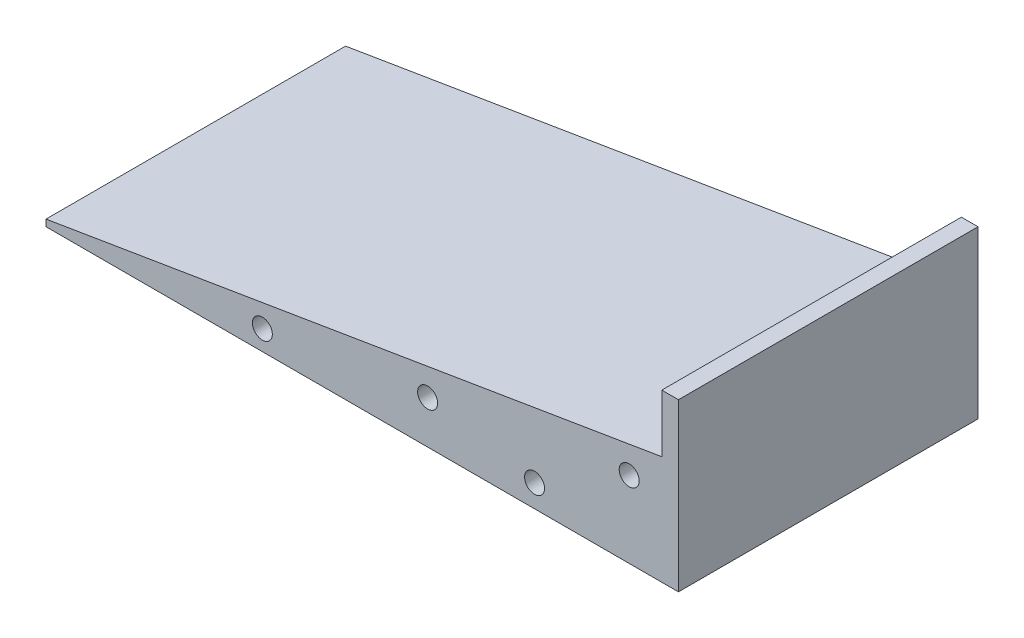
ISO-10303-21;
HEADER;
FILE_DESCRIPTION(('STEP AP214'),'2;1');
FILE_NAME('part.step','',(''),(''),'','','');
FILE_SCHEMA(('AUTOMOTIVE_DESIGN { 1 0 10303 214 1 1 1 1 }'));
ENDSEC;
DATA;
#1=APPLICATION_CONTEXT('core data for automotive mechanical design processes');
#2=APPLICATION_PROTOCOL_DEFINITION('international standard','automotive_design',2000,#1);
#3=PRODUCT_CONTEXT('',#1,'mechanical');
#4=PRODUCT('Part','Part','',(#3));
#5=PRODUCT_RELATED_PRODUCT_CATEGORY('part','',(#4));
#6=PRODUCT_DEFINITION_FORMATION('','',#4);
#7=PRODUCT_DEFINITION_CONTEXT('part definition',#1,'design');
#8=PRODUCT_DEFINITION('design','',#6,#7);
#9=PRODUCT_DEFINITION_SHAPE('','',#8);
#10=(LENGTH_UNIT() NAMED_UNIT(*) SI_UNIT(.MILLI.,.METRE.));
#11=(NAMED_UNIT(*) PLANE_ANGLE_UNIT() SI_UNIT($,.RADIAN.));
#12=(NAMED_UNIT(*) SI_UNIT($,.STERADIAN.) SOLID_ANGLE_UNIT());
#13=UNCERTAINTY_MEASURE_WITH_UNIT(LENGTH_MEASURE(1.E-05),#10,'distance_accuracy_value','');
#14=(GEOMETRIC_REPRESENTATION_CONTEXT(3) GLOBAL_UNCERTAINTY_ASSIGNED_CONTEXT((#13)) GLOBAL_UNIT_ASSIGNED_CONTEXT((#10,
#11,#12)) REPRESENTATION_CONTEXT('',''));
#15=CARTESIAN_POINT('',(0.,0.,0.));
#16=DIRECTION('',(0.,0.,1.));
#17=DIRECTION('',(1.,0.,0.));
#18=AXIS2_PLACEMENT_3D('',#15,#16,#17);
#19=CARTESIAN_POINT('',(-40.7960134047091,6.,200.));
#20=DIRECTION('',(0.,0.,-1.));
#21=DIRECTION('',(-1.,0.,0.));
#22=AXIS2_PLACEMENT_3D('',#19,#20,#21);
#23=CYLINDRICAL_SURFACE('',#22,3.);
#24=CARTESIAN_POINT('',(-40.7960134047091,6.,55.));
#25=DIRECTION('',(0.,0.,1.));
#26=DIRECTION('',(1.,0.,0.));
#27=AXIS2_PLACEMENT_3D('',#24,#25,#26);
#28=CIRCLE('',#27,3.);
#29=CARTESIAN_POINT('',(-37.7960134047091,6.,55.));
#30=VERTEX_POINT('',#29);
#31=EDGE_CURVE('E153',#30,#30,#28,.T.);
#32=ORIENTED_EDGE('',*,*,#31,.F.);
#33=EDGE_LOOP('',(#32));
#34=FACE_BOUND('',#33,.T.);
#35=CARTESIAN_POINT('',(-40.7960134047091,6.,145.));
#36=DIRECTION('',(0.,0.,-1.));
#37=DIRECTION('',(-1.,0.,0.));
#38=AXIS2_PLACEMENT_3D('',#35,#36,#37);
#39=CIRCLE('',#38,3.);
#40=CARTESIAN_POINT('',(-43.7960134047091,6.,145.));
#41=VERTEX_POINT('',#40);
#42=EDGE_CURVE('E133',#41,#41,#39,.T.);
#43=ORIENTED_EDGE('',*,*,#42,.F.);
#44=EDGE_LOOP('',(#43));
#45=FACE_BOUND('',#44,.T.);
#46=ADVANCED_FACE('F35',(#34,#45),#23,.F.);
#47=CARTESIAN_POINT('',(8.86154286614935,12.9010851063287,200.));
#48=DIRECTION('',(0.,0.,-1.));
#49=DIRECTION('',(-1.,0.,0.));
#50=AXIS2_PLACEMENT_3D('',#47,#48,#49);
#51=CYLINDRICAL_SURFACE('',#50,3.);
#52=CARTESIAN_POINT('',(8.86154286614935,12.9010851063287,55.));
#53=DIRECTION('',(0.,0.,1.));
#54=DIRECTION('',(1.,0.,0.));
#55=AXIS2_PLACEMENT_3D('',#52,#53,#54);
#56=CIRCLE('',#55,3.);
#57=CARTESIAN_POINT('',(11.8615428661494,12.9010851063287,55.));
#58=VERTEX_POINT('',#57);
#59=EDGE_CURVE('E156',#58,#58,#56,.T.);
#60=ORIENTED_EDGE('',*,*,#59,.F.);
#61=EDGE_LOOP('',(#60));
#62=FACE_BOUND('',#61,.T.);
#63=CARTESIAN_POINT('',(8.86154286614935,12.9010851063287,145.));
#64=DIRECTION('',(0.,0.,-1.));
#65=DIRECTION('',(-1.,0.,0.));
#66=AXIS2_PLACEMENT_3D('',#63,#64,#65);
#67=CIRCLE('',#66,3.);
#68=CARTESIAN_POINT('',(5.86154286614935,12.9010851063287,145.));
#69=VERTEX_POINT('',#68);
#70=EDGE_CURVE('E135',#69,#69,#67,.T.);
#71=ORIENTED_EDGE('',*,*,#70,.F.);
#72=EDGE_LOOP('',(#71));
#73=FACE_BOUND('',#72,.T.);
#74=ADVANCED_FACE('F180',(#62,#73),#51,.F.);
#75=CARTESIAN_POINT('',(40.9814690667464,6.77616521020496,200.));
#76=DIRECTION('',(0.,0.,-1.));
#77=DIRECTION('',(-1.,0.,0.));
#78=AXIS2_PLACEMENT_3D('',#75,#76,#77);
#79=CYLINDRICAL_SURFACE('',#78,3.00000000000001);
#80=CARTESIAN_POINT('',(40.9814690667464,6.77616521020496,55.));
#81=DIRECTION('',(0.,0.,1.));
#82=DIRECTION('',(1.,0.,0.));
#83=AXIS2_PLACEMENT_3D('',#80,#81,#82);
#84=CIRCLE('',#83,3.00000000000001);
#85=CARTESIAN_POINT('',(43.9814690667464,6.77616521020496,55.));
#86=VERTEX_POINT('',#85);
#87=EDGE_CURVE('E159',#86,#86,#84,.T.);
#88=ORIENTED_EDGE('',*,*,#87,.F.);
#89=EDGE_LOOP('',(#88));
#90=FACE_BOUND('',#89,.T.);
#91=CARTESIAN_POINT('',(40.9814690667464,6.77616521020496,145.));
#92=DIRECTION('',(0.,0.,-1.));
#93=DIRECTION('',(-1.,0.,0.));
#94=AXIS2_PLACEMENT_3D('',#91,#92,#93);
#95=CIRCLE('',#94,3.00000000000001);
#96=CARTESIAN_POINT('',(37.9814690667464,6.77616521020496,145.));
#97=VERTEX_POINT('',#96);
#98=EDGE_CURVE('E140',#97,#97,#95,.T.);
#99=ORIENTED_EDGE('',*,*,#98,.F.);
#100=EDGE_LOOP('',(#99));
#101=FACE_BOUND('',#100,.T.);
#102=ADVANCED_FACE('F186',(#90,#101),#79,.F.);
#103=CARTESIAN_POINT('',(69.4060048708337,22.9393971638675,200.));
#104=DIRECTION('',(0.,0.,-1.));
#105=DIRECTION('',(-1.,0.,0.));
#106=AXIS2_PLACEMENT_3D('',#103,#104,#105);
#107=CYLINDRICAL_SURFACE('',#106,3.00000000000001);
#108=CARTESIAN_POINT('',(69.4060048708337,22.9393971638675,55.));
#109=DIRECTION('',(0.,0.,1.));
#110=DIRECTION('',(1.,0.,0.));
#111=AXIS2_PLACEMENT_3D('',#108,#109,#110);
#112=CIRCLE('',#111,3.00000000000001);
#113=CARTESIAN_POINT('',(72.4060048708337,22.9393971638675,55.));
#114=VERTEX_POINT('',#113);
#115=EDGE_CURVE('E162',#114,#114,#112,.T.);
#116=ORIENTED_EDGE('',*,*,#115,.F.);
#117=EDGE_LOOP('',(#116));
#118=FACE_BOUND('',#117,.T.);
#119=CARTESIAN_POINT('',(69.4060048708337,22.9393971638675,145.));
#120=DIRECTION('',(0.,0.,-1.));
#121=DIRECTION('',(-1.,0.,0.));
#122=AXIS2_PLACEMENT_3D('',#119,#120,#121);
#123=CIRCLE('',#122,3.00000000000001);
#124=CARTESIAN_POINT('',(66.4060048708336,22.9393971638675,145.));
#125=VERTEX_POINT('',#124);
#126=EDGE_CURVE('E129',#125,#125,#123,.T.);
#127=ORIENTED_EDGE('',*,*,#126,.F.);
#128=EDGE_LOOP('',(#127));
#129=FACE_BOUND('',#128,.T.);
#130=ADVANCED_FACE('F195',(#118,#129),#107,.F.);
#131=CARTESIAN_POINT('',(-105.796013404709,2.,200.));
#132=DIRECTION('',(0.163567680624933,-0.986532114963816,0.));
#133=DIRECTION('',(0.986532114963816,0.163567680624933,0.));
#134=AXIS2_PLACEMENT_3D('',#131,#132,#133);
#135=PLANE('',#134);
#136=DIRECTION('',(0.,0.,-1.));
#137=VECTOR('',#136,1.);
#138=CARTESIAN_POINT('',(79.2039865952909,32.6731230100121,217.967909160371));
#139=LINE('',#138,#137);
#140=CARTESIAN_POINT('',(79.2039865952909,32.6731230100121,145.));
#141=VERTEX_POINT('',#140);
#142=CARTESIAN_POINT('',(79.2039865952909,32.6731230100121,55.));
#143=VERTEX_POINT('',#142);
#144=EDGE_CURVE('E112',#141,#143,#139,.T.);
#145=ORIENTED_EDGE('',*,*,#144,.T.);
#146=DIRECTION('',(-0.986532114963816,-0.163567680624933,0.));
#147=VECTOR('',#146,1.);
#148=CARTESIAN_POINT('',(-105.796013404709,1.99999999999999,55.));
#149=LINE('',#148,#147);
#150=CARTESIAN_POINT('',(-105.796013404709,2.,55.));
#151=VERTEX_POINT('',#150);
#152=EDGE_CURVE('E49',#143,#151,#149,.T.);
#153=ORIENTED_EDGE('',*,*,#152,.T.);
#154=DIRECTION('',(0.,0.,-1.));
#155=VECTOR('',#154,1.);
#156=CARTESIAN_POINT('',(-105.796013404709,2.,200.));
#157=LINE('',#156,#155);
#158=CARTESIAN_POINT('',(-105.796013404709,2.,145.));
#159=VERTEX_POINT('',#158);
#160=EDGE_CURVE('E107',#159,#151,#157,.T.);
#161=ORIENTED_EDGE('',*,*,#160,.F.);
#162=DIRECTION('',(0.986532114963816,0.163567680624933,0.));
#163=VECTOR('',#162,1.);
#164=CARTESIAN_POINT('',(-105.796013404709,2.,145.));
#165=LINE('',#164,#163);
#166=EDGE_CURVE('E121',#159,#141,#165,.T.);
#167=ORIENTED_EDGE('',*,*,#166,.T.);
#168=EDGE_LOOP('',(#145,#153,#161,#167));
#169=FACE_BOUND('',#168,.T.);
#170=ADVANCED_FACE('F128',(#169),#135,.F.);
#171=CARTESIAN_POINT('',(-105.796013404709,0.,200.));
#172=DIRECTION('',(1.,0.,0.));
#173=DIRECTION('',(0.,0.,-1.));
#174=AXIS2_PLACEMENT_3D('',#171,#172,#173);
#175=PLANE('',#174);
#176=ORIENTED_EDGE('',*,*,#160,.T.);
#177=DIRECTION('',(0.,1.,0.));
#178=VECTOR('',#177,1.);
#179=CARTESIAN_POINT('',(-105.796013404709,-199.248588451713,55.));
#180=LINE('',#179,#178);
#181=CARTESIAN_POINT('',(-105.796013404709,0.,55.));
#182=VERTEX_POINT('',#181);
#183=EDGE_CURVE('E95',#182,#151,#180,.T.);
#184=ORIENTED_EDGE('',*,*,#183,.F.);
#185=DIRECTION('',(0.,0.,-1.));
#186=VECTOR('',#185,1.);
#187=CARTESIAN_POINT('',(-105.796013404709,0.,200.));
#188=LINE('',#187,#186);
#189=CARTESIAN_POINT('',(-105.796013404709,0.,145.));
#190=VERTEX_POINT('',#189);
#191=EDGE_CURVE('E117',#190,#182,#188,.T.);
#192=ORIENTED_EDGE('',*,*,#191,.F.);
#193=DIRECTION('',(0.,1.,0.));
#194=VECTOR('',#193,1.);
#195=CARTESIAN_POINT('',(-105.796013404709,-199.248588451713,145.));
#196=LINE('',#195,#194);
#197=EDGE_CURVE('E148',#190,#159,#196,.T.);
#198=ORIENTED_EDGE('',*,*,#197,.T.);
#199=EDGE_LOOP('',(#176,#184,#192,#198));
#200=FACE_BOUND('',#199,.T.);
#201=ADVANCED_FACE('F37',(#200),#175,.F.);
#202=CARTESIAN_POINT('',(-105.796013404709,0.,200.));
#203=DIRECTION('',(0.,1.,0.));
#204=DIRECTION('',(0.,0.,1.));
#205=AXIS2_PLACEMENT_3D('',#202,#203,#204);
#206=PLANE('',#205);
#207=ORIENTED_EDGE('',*,*,#191,.T.);
#208=DIRECTION('',(-1.,0.,0.));
#209=VECTOR('',#208,1.);
#210=CARTESIAN_POINT('',(84.2039865952909,0.,55.));
#211=LINE('',#210,#209);
#212=CARTESIAN_POINT('',(84.2039865952909,0.,55.));
#213=VERTEX_POINT('',#212);
#214=EDGE_CURVE('E104',#213,#182,#211,.T.);
#215=ORIENTED_EDGE('',*,*,#214,.F.);
#216=DIRECTION('',(0.,0.,-1.));
#217=VECTOR('',#216,1.);
#218=CARTESIAN_POINT('',(84.2039865952909,0.,200.));
#219=LINE('',#218,#217);
#220=CARTESIAN_POINT('',(84.2039865952909,0.,145.));
#221=VERTEX_POINT('',#220);
#222=EDGE_CURVE('E103',#221,#213,#219,.T.);
#223=ORIENTED_EDGE('',*,*,#222,.F.);
#224=DIRECTION('',(1.,0.,0.));
#225=VECTOR('',#224,1.);
#226=CARTESIAN_POINT('',(84.2039865952909,0.,145.));
#227=LINE('',#226,#225);
#228=EDGE_CURVE('E130',#190,#221,#227,.T.);
#229=ORIENTED_EDGE('',*,*,#228,.F.);
#230=EDGE_LOOP('',(#207,#215,#223,#229));
#231=FACE_BOUND('',#230,.T.);
#232=ADVANCED_FACE('F172',(#231),#206,.F.);
#233=CARTESIAN_POINT('',(84.2039865952909,0.,200.));
#234=DIRECTION('',(-1.,0.,0.));
#235=DIRECTION('',(0.,0.,1.));
#236=AXIS2_PLACEMENT_3D('',#233,#234,#235);
#237=PLANE('',#236);
#238=ORIENTED_EDGE('',*,*,#222,.T.);
#239=DIRECTION('',(0.,1.,0.));
#240=VECTOR('',#239,1.);
#241=CARTESIAN_POINT('',(84.2039865952909,-199.248588451713,55.));
#242=LINE('',#241,#240);
#243=CARTESIAN_POINT('',(84.2039865952909,50.,55.));
#244=VERTEX_POINT('',#243);
#245=EDGE_CURVE('E89',#213,#244,#242,.T.);
#246=ORIENTED_EDGE('',*,*,#245,.T.);
#247=DIRECTION('',(0.,0.,1.));
#248=VECTOR('',#247,1.);
#249=CARTESIAN_POINT('',(84.2039865952909,50.,200.));
#250=LINE('',#249,#248);
#251=CARTESIAN_POINT('',(84.2039865952909,50.,145.));
#252=VERTEX_POINT('',#251);
#253=EDGE_CURVE('E101',#244,#252,#250,.T.);
#254=ORIENTED_EDGE('',*,*,#253,.T.);
#255=DIRECTION('',(0.,1.,0.));
#256=VECTOR('',#255,1.);
#257=CARTESIAN_POINT('',(84.2039865952909,-199.248588451713,145.));
#258=LINE('',#257,#256);
#259=EDGE_CURVE('E149',#221,#252,#258,.T.);
#260=ORIENTED_EDGE('',*,*,#259,.F.);
#261=EDGE_LOOP('',(#238,#246,#254,#260));
#262=FACE_BOUND('',#261,.T.);
#263=ADVANCED_FACE('F99',(#262),#237,.F.);
#264=CARTESIAN_POINT('',(-95.7960134047091,50.,200.));
#265=DIRECTION('',(0.,1.,0.));
#266=DIRECTION('',(0.,0.,1.));
#267=AXIS2_PLACEMENT_3D('',#264,#265,#266);
#268=PLANE('',#267);
#269=DIRECTION('',(1.,0.,0.));
#270=VECTOR('',#269,1.);
#271=CARTESIAN_POINT('',(84.2039865952909,50.,55.));
#272=LINE('',#271,#270);
#273=CARTESIAN_POINT('',(79.2039865952909,50.,55.));
#274=VERTEX_POINT('',#273);
#275=EDGE_CURVE('E86',#274,#244,#272,.T.);
#276=ORIENTED_EDGE('',*,*,#275,.F.);
#277=DIRECTION('',(0.,0.,-1.));
#278=VECTOR('',#277,1.);
#279=CARTESIAN_POINT('',(79.2039865952909,50.,217.967909160371));
#280=LINE('',#279,#278);
#281=CARTESIAN_POINT('',(79.2039865952909,50.,145.));
#282=VERTEX_POINT('',#281);
#283=EDGE_CURVE('E108',#282,#274,#280,.T.);
#284=ORIENTED_EDGE('',*,*,#283,.F.);
#285=DIRECTION('',(-1.,0.,0.));
#286=VECTOR('',#285,1.);
#287=CARTESIAN_POINT('',(84.2039865952909,50.,145.));
#288=LINE('',#287,#286);
#289=EDGE_CURVE('E57',#252,#282,#288,.T.);
#290=ORIENTED_EDGE('',*,*,#289,.F.);
#291=ORIENTED_EDGE('',*,*,#253,.F.);
#292=EDGE_LOOP('',(#276,#284,#290,#291));
#293=FACE_BOUND('',#292,.T.);
#294=ADVANCED_FACE('F106',(#293),#268,.T.);
#295=CARTESIAN_POINT('',(79.2039865952909,32.6731230100121,217.967909160371));
#296=DIRECTION('',(-1.,0.,0.));
#297=DIRECTION('',(0.,0.,1.));
#298=AXIS2_PLACEMENT_3D('',#295,#296,#297);
#299=PLANE('',#298);
#300=DIRECTION('',(0.,1.,0.));
#301=VECTOR('',#300,1.);
#302=CARTESIAN_POINT('',(79.2039865952909,32.6731230100121,55.));
#303=LINE('',#302,#301);
#304=EDGE_CURVE('E11',#143,#274,#303,.T.);
#305=ORIENTED_EDGE('',*,*,#304,.F.);
#306=ORIENTED_EDGE('',*,*,#144,.F.);
#307=DIRECTION('',(0.,-1.,0.));
#308=VECTOR('',#307,1.);
#309=CARTESIAN_POINT('',(79.2039865952909,32.6731230100121,145.));
#310=LINE('',#309,#308);
#311=EDGE_CURVE('E43',#282,#141,#310,.T.);
#312=ORIENTED_EDGE('',*,*,#311,.F.);
#313=ORIENTED_EDGE('',*,*,#283,.T.);
#314=EDGE_LOOP('',(#305,#306,#312,#313));
#315=FACE_BOUND('',#314,.T.);
#316=ADVANCED_FACE('F132',(#315),#299,.T.);
#317=CARTESIAN_POINT('',(84.2039865952909,-199.248588451713,145.));
#318=DIRECTION('',(0.,0.,-1.));
#319=DIRECTION('',(-1.,0.,0.));
#320=AXIS2_PLACEMENT_3D('',#317,#318,#319);
#321=PLANE('',#320);
#322=ORIENTED_EDGE('',*,*,#42,.T.);
#323=EDGE_LOOP('',(#322));
#324=FACE_BOUND('',#323,.T.);
#325=ORIENTED_EDGE('',*,*,#70,.T.);
#326=EDGE_LOOP('',(#325));
#327=FACE_BOUND('',#326,.T.);
#328=ORIENTED_EDGE('',*,*,#98,.T.);
#329=EDGE_LOOP('',(#328));
#330=FACE_BOUND('',#329,.T.);
#331=ORIENTED_EDGE('',*,*,#126,.T.);
#332=EDGE_LOOP('',(#331));
#333=FACE_BOUND('',#332,.T.);
#334=ORIENTED_EDGE('',*,*,#197,.F.);
#335=ORIENTED_EDGE('',*,*,#228,.T.);
#336=ORIENTED_EDGE('',*,*,#259,.T.);
#337=ORIENTED_EDGE('',*,*,#289,.T.);
#338=ORIENTED_EDGE('',*,*,#311,.T.);
#339=ORIENTED_EDGE('',*,*,#166,.F.);
#340=EDGE_LOOP('',(#334,#335,#336,#337,#338,#339));
#341=FACE_BOUND('',#340,.T.);
#342=ADVANCED_FACE('F120',(#324,#327,#330,#333,#341),#321,.F.);
#343=CARTESIAN_POINT('',(84.2039865952909,-199.248588451713,55.));
#344=DIRECTION('',(0.,0.,1.));
#345=DIRECTION('',(1.,0.,0.));
#346=AXIS2_PLACEMENT_3D('',#343,#344,#345);
#347=PLANE('',#346);
#348=ORIENTED_EDGE('',*,*,#31,.T.);
#349=EDGE_LOOP('',(#348));
#350=FACE_BOUND('',#349,.T.);
#351=ORIENTED_EDGE('',*,*,#59,.T.);
#352=EDGE_LOOP('',(#351));
#353=FACE_BOUND('',#352,.T.);
#354=ORIENTED_EDGE('',*,*,#87,.T.);
#355=EDGE_LOOP('',(#354));
#356=FACE_BOUND('',#355,.T.);
#357=ORIENTED_EDGE('',*,*,#115,.T.);
#358=EDGE_LOOP('',(#357));
#359=FACE_BOUND('',#358,.T.);
#360=ORIENTED_EDGE('',*,*,#304,.T.);
#361=ORIENTED_EDGE('',*,*,#275,.T.);
#362=ORIENTED_EDGE('',*,*,#245,.F.);
#363=ORIENTED_EDGE('',*,*,#214,.T.);
#364=ORIENTED_EDGE('',*,*,#183,.T.);
#365=ORIENTED_EDGE('',*,*,#152,.F.);
#366=EDGE_LOOP('',(#360,#361,#362,#363,#364,#365));
#367=FACE_BOUND('',#366,.T.);
#368=ADVANCED_FACE('F88',(#350,#353,#356,#359,#367),#347,.F.);
#369=CLOSED_SHELL('',(#46,#74,#102,#130,#170,#201,#232,#263,#294,#316,#342,#368));
#370=MANIFOLD_SOLID_BREP('B2',#369);
#371=ADVANCED_BREP_SHAPE_REPRESENTATION('',(#18,#370),#14);
#372=SHAPE_DEFINITION_REPRESENTATION(#9,#371);
ENDSEC;
END-ISO-10303-21;
